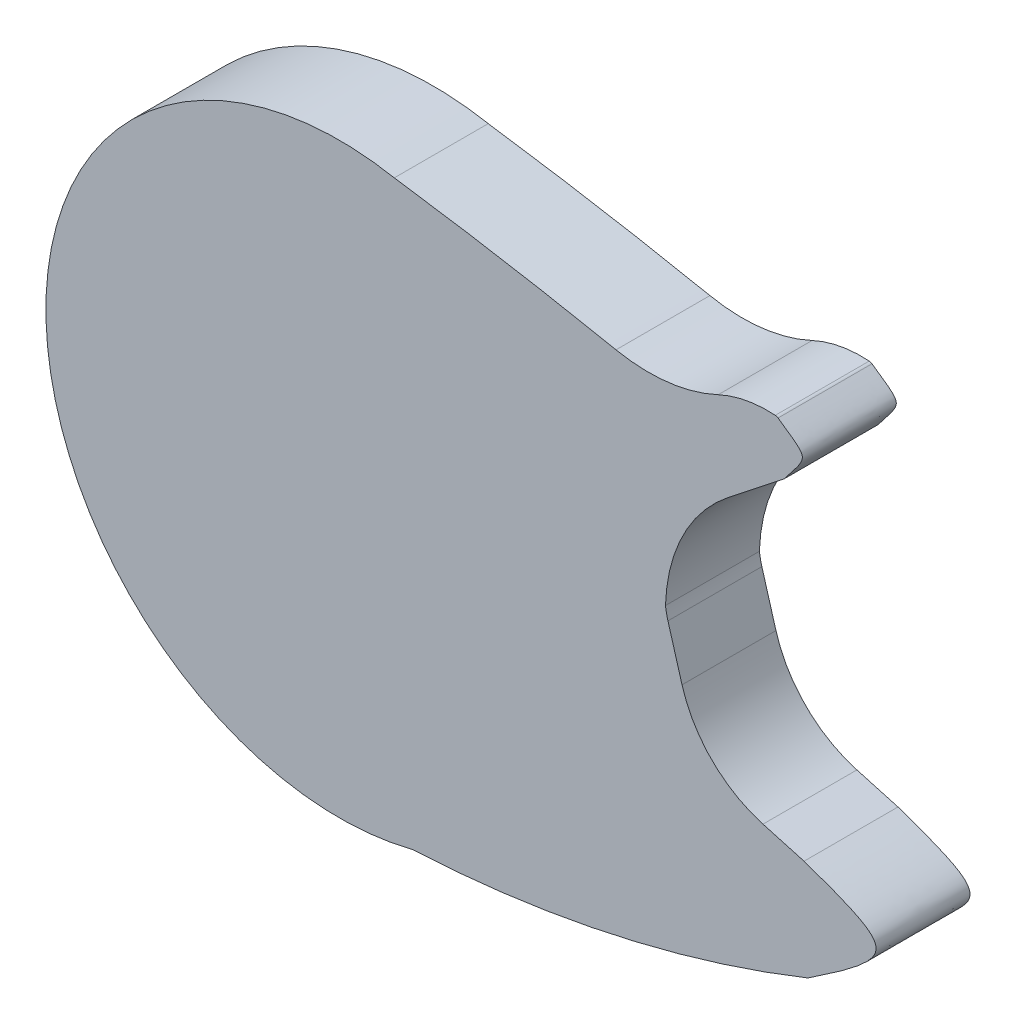
ISO-10303-21;
HEADER;
FILE_DESCRIPTION(('STEP AP214'),'2;1');
FILE_NAME('part.step','',(''),(''),'','','');
FILE_SCHEMA(('AUTOMOTIVE_DESIGN { 1 0 10303 214 1 1 1 1 }'));
ENDSEC;
DATA;
#1=APPLICATION_CONTEXT('core data for automotive mechanical design processes');
#2=APPLICATION_PROTOCOL_DEFINITION('international standard','automotive_design',2000,#1);
#3=PRODUCT_CONTEXT('',#1,'mechanical');
#4=PRODUCT('Part','Part','',(#3));
#5=PRODUCT_RELATED_PRODUCT_CATEGORY('part','',(#4));
#6=PRODUCT_DEFINITION_FORMATION('','',#4);
#7=PRODUCT_DEFINITION_CONTEXT('part definition',#1,'design');
#8=PRODUCT_DEFINITION('design','',#6,#7);
#9=PRODUCT_DEFINITION_SHAPE('','',#8);
#10=(LENGTH_UNIT() NAMED_UNIT(*) SI_UNIT(.MILLI.,.METRE.));
#11=(NAMED_UNIT(*) PLANE_ANGLE_UNIT() SI_UNIT($,.RADIAN.));
#12=(NAMED_UNIT(*) SI_UNIT($,.STERADIAN.) SOLID_ANGLE_UNIT());
#13=UNCERTAINTY_MEASURE_WITH_UNIT(LENGTH_MEASURE(1.E-05),#10,'distance_accuracy_value','');
#14=(GEOMETRIC_REPRESENTATION_CONTEXT(3) GLOBAL_UNCERTAINTY_ASSIGNED_CONTEXT((#13)) GLOBAL_UNIT_ASSIGNED_CONTEXT((#10,
#11,#12)) REPRESENTATION_CONTEXT('',''));
#15=CARTESIAN_POINT('',(0.,0.,0.));
#16=DIRECTION('',(0.,0.,1.));
#17=DIRECTION('',(1.,0.,0.));
#18=AXIS2_PLACEMENT_3D('',#15,#16,#17);
#19=CARTESIAN_POINT('',(0.,0.,0.));
#20=DIRECTION('',(0.,0.,1.));
#21=DIRECTION('',(1.,0.,0.));
#22=AXIS2_PLACEMENT_3D('',#19,#20,#21);
#23=PLANE('',#22);
#24=CARTESIAN_POINT('',(1.68720769985722,0.260608310681954,0.));
#25=DIRECTION('',(0.,0.,1.));
#26=DIRECTION('',(1.,0.,0.));
#27=AXIS2_PLACEMENT_3D('',#24,#25,#26);
#28=CIRCLE('',#27,0.3);
#29=CARTESIAN_POINT('',(1.38851734794613,0.227690829124057,0.));
#30=VERTEX_POINT('',#29);
#31=CARTESIAN_POINT('',(1.3991706844946,0.176735324679344,0.));
#32=VERTEX_POINT('',#31);
#33=EDGE_CURVE('E182',#30,#32,#28,.T.);
#34=ORIENTED_EDGE('',*,*,#33,.T.);
#35=DIRECTION('',(0.279576620008697,-0.960123384542066,0.));
#36=VECTOR('',#35,1.);
#37=CARTESIAN_POINT('',(1.33724790399965,0.389390837816383,0.));
#38=LINE('',#37,#36);
#39=CARTESIAN_POINT('',(1.45912919072284,-0.0291744682431,0.));
#40=VERTEX_POINT('',#39);
#41=EDGE_CURVE('E227',#32,#40,#38,.T.);
#42=ORIENTED_EDGE('',*,*,#41,.T.);
#43=CARTESIAN_POINT('',(1.93919088299388,0.110613841761249,0.));
#44=DIRECTION('',(0.,0.,1.));
#45=DIRECTION('',(1.,0.,0.));
#46=AXIS2_PLACEMENT_3D('',#43,#44,#45);
#47=CIRCLE('',#46,0.499999999999998);
#48=CARTESIAN_POINT('',(1.80392969712394,-0.370743002583002,0.));
#49=VERTEX_POINT('',#48);
#50=EDGE_CURVE('E225',#40,#49,#47,.T.);
#51=ORIENTED_EDGE('',*,*,#50,.T.);
#52=DIRECTION('',(0.962713688688509,-0.27052237173987,0.));
#53=VECTOR('',#52,1.);
#54=CARTESIAN_POINT('',(0.0354611482322684,0.126196338588383,0.));
#55=LINE('',#54,#53);
#56=CARTESIAN_POINT('',(1.97884477834677,-0.419894108650615,0.));
#57=VERTEX_POINT('',#56);
#58=EDGE_CURVE('E160',#49,#57,#55,.T.);
#59=ORIENTED_EDGE('',*,*,#58,.T.);
#60=CARTESIAN_POINT('',(1.99572109811097,-0.842296250533892,0.));
#61=CARTESIAN_POINT('',(2.41082933169147,-0.567859808421167,0.));
#62=CARTESIAN_POINT('',(1.97884477834677,-0.419894108650615,0.));
#63=(BOUNDED_CURVE() B_SPLINE_CURVE(2,(#60,#61,#62),.UNSPECIFIED.,.F.,
.F.) B_SPLINE_CURVE_WITH_KNOTS((3,3),(0.,1.),
.UNSPECIFIED.) CURVE() GEOMETRIC_REPRESENTATION_ITEM() RATIONAL_B_SPLINE_CURVE((1.,
2.37796476795875,1.)) REPRESENTATION_ITEM(''));
#64=CARTESIAN_POINT('',(1.99572109811097,-0.842296250533891,0.));
#65=VERTEX_POINT('',#64);
#66=EDGE_CURVE('E216',#65,#57,#63,.T.);
#67=ORIENTED_EDGE('',*,*,#66,.F.);
#68=CARTESIAN_POINT('',(0.0516204911302641,4.00637457906284,0.));
#69=DIRECTION('',(0.,0.,1.));
#70=DIRECTION('',(1.,0.,0.));
#71=AXIS2_PLACEMENT_3D('',#68,#69,#70);
#72=CIRCLE('',#71,5.22390045692345);
#73=CARTESIAN_POINT('',(0.309116921319376,-1.21117576303113,0.));
#74=VERTEX_POINT('',#73);
#75=EDGE_CURVE('E213',#65,#74,#72,.F.);
#76=ORIENTED_EDGE('',*,*,#75,.T.);
#77=CARTESIAN_POINT('',(0.,0.,0.));
#78=DIRECTION('',(0.,0.,1.));
#79=DIRECTION('',(1.,0.,0.));
#80=AXIS2_PLACEMENT_3D('',#77,#78,#79);
#81=CIRCLE('',#80,1.25);
#82=CARTESIAN_POINT('',(0.233831734369341,1.2279343304924,0.));
#83=VERTEX_POINT('',#82);
#84=EDGE_CURVE('E210',#83,#74,#81,.T.);
#85=ORIENTED_EDGE('',*,*,#84,.F.);
#86=CARTESIAN_POINT('',(-2.04961009553152,-14.8939138780352,0.));
#87=DIRECTION('',(0.,0.,1.));
#88=DIRECTION('',(1.,0.,0.));
#89=AXIS2_PLACEMENT_3D('',#86,#87,#88);
#90=CIRCLE('',#89,16.2827545657775);
#91=CARTESIAN_POINT('',(1.17795402322161,1.06575172337021,0.));
#92=VERTEX_POINT('',#91);
#93=EDGE_CURVE('E208',#92,#83,#90,.T.);
#94=ORIENTED_EDGE('',*,*,#93,.F.);
#95=CARTESIAN_POINT('',(1.31670787313074,1.75186204185798,0.));
#96=DIRECTION('',(0.,0.,1.));
#97=DIRECTION('',(1.,0.,0.));
#98=AXIS2_PLACEMENT_3D('',#95,#96,#97);
#99=CIRCLE('',#98,0.700000000000001);
#100=CARTESIAN_POINT('',(1.613052317064,1.11768543353039,0.));
#101=VERTEX_POINT('',#100);
#102=EDGE_CURVE('E206',#101,#92,#99,.F.);
#103=ORIENTED_EDGE('',*,*,#102,.F.);
#104=CARTESIAN_POINT('',(1.82398751273677,0.666284471888547,0.));
#105=DIRECTION('',(0.,0.,1.));
#106=DIRECTION('',(1.,0.,0.));
#107=AXIS2_PLACEMENT_3D('',#104,#105,#106);
#108=CIRCLE('',#107,0.498253434453484);
#109=CARTESIAN_POINT('',(1.85648734935261,1.16347683462619,0.));
#110=VERTEX_POINT('',#109);
#111=EDGE_CURVE('E204',#110,#101,#108,.T.);
#112=ORIENTED_EDGE('',*,*,#111,.F.);
#113=CARTESIAN_POINT('',(1.85494442950019,1.13987277851956,0.));
#114=DIRECTION('',(0.,0.,1.));
#115=DIRECTION('',(1.,0.,0.));
#116=AXIS2_PLACEMENT_3D('',#113,#114,#115);
#117=CIRCLE('',#116,0.023654430163407);
#118=CARTESIAN_POINT('',(1.86820923768672,1.15945789863996,0.));
#119=VERTEX_POINT('',#118);
#120=EDGE_CURVE('E199',#119,#110,#117,.T.);
#121=ORIENTED_EDGE('',*,*,#120,.F.);
#122=CARTESIAN_POINT('',(1.89441183631001,0.94809673782148,0.));
#123=CARTESIAN_POINT('',(1.99572109811097,1.07309537649882,0.));
#124=CARTESIAN_POINT('',(1.86820923768672,1.15945789863996,0.));
#125=(BOUNDED_CURVE() B_SPLINE_CURVE(2,(#122,#123,#124),.UNSPECIFIED.,.F.,
.F.) B_SPLINE_CURVE_WITH_KNOTS((3,3),(0.,1.),
.UNSPECIFIED.) CURVE() GEOMETRIC_REPRESENTATION_ITEM() RATIONAL_B_SPLINE_CURVE((1.,
3.70941285067081,1.)) REPRESENTATION_ITEM(''));
#126=CARTESIAN_POINT('',(1.89441183631001,0.94809673782148,0.));
#127=VERTEX_POINT('',#126);
#128=EDGE_CURVE('E195',#127,#119,#125,.T.);
#129=ORIENTED_EDGE('',*,*,#128,.F.);
#130=DIRECTION('',(-0.785367527781347,-0.61902976205237,0.));
#131=VECTOR('',#130,1.);
#132=CARTESIAN_POINT('',(0.265002256658093,-0.336210276026174,0.));
#133=LINE('',#132,#131);
#134=CARTESIAN_POINT('',(1.65547294782722,0.759764169883003,0.));
#135=VERTEX_POINT('',#134);
#136=EDGE_CURVE('E190',#127,#135,#133,.T.);
#137=ORIENTED_EDGE('',*,*,#136,.T.);
#138=CARTESIAN_POINT('',(2.08879378126389,0.21000690043606,0.));
#139=DIRECTION('',(0.,0.,1.));
#140=DIRECTION('',(1.,0.,0.));
#141=AXIS2_PLACEMENT_3D('',#138,#139,#140);
#142=CIRCLE('',#141,0.700000000000001);
#143=EDGE_CURVE('E184',#135,#30,#142,.T.);
#144=ORIENTED_EDGE('',*,*,#143,.T.);
#145=EDGE_LOOP('',(#34,#42,#51,#59,#67,#76,#85,#94,#103,#112,#121,#129,#137,#144));
#146=FACE_BOUND('',#145,.T.);
#147=CARTESIAN_POINT('',(0.,0.,0.));
#148=DIRECTION('',(0.,0.,-1.));
#149=DIRECTION('',(-1.,0.,0.));
#150=AXIS2_PLACEMENT_3D('',#147,#148,#149);
#151=CIRCLE('',#150,0.75);
#152=CARTESIAN_POINT('',(-0.75,0.,0.));
#153=VERTEX_POINT('',#152);
#154=EDGE_CURVE('E565',#153,#153,#151,.T.);
#155=ORIENTED_EDGE('',*,*,#154,.F.);
#156=EDGE_LOOP('',(#155));
#157=FACE_BOUND('',#156,.T.);
#158=ADVANCED_FACE('F46',(#146,#157),#23,.F.);
#159=CARTESIAN_POINT('',(1.68720769985722,0.260608310681954,0.4));
#160=DIRECTION('',(0.,0.,-1.));
#161=DIRECTION('',(-1.,0.,0.));
#162=AXIS2_PLACEMENT_3D('',#159,#160,#161);
#163=CYLINDRICAL_SURFACE('',#162,0.3);
#164=ORIENTED_EDGE('',*,*,#33,.F.);
#165=CARTESIAN_POINT('',(1.38901687063512,0.227678214786076,0.4));
#166=DIRECTION('',(0.,0.,-1.));
#167=VECTOR('',#166,1.);
#168=LINE('',#165,#167);
#169=CARTESIAN_POINT('',(1.38851734794613,0.227690829124057,0.4));
#170=VERTEX_POINT('',#169);
#171=EDGE_CURVE('E12',#170,#30,#168,.T.);
#172=ORIENTED_EDGE('',*,*,#171,.F.);
#173=CARTESIAN_POINT('',(1.68720769985722,0.260608310681954,0.4));
#174=DIRECTION('',(0.,0.,1.));
#175=DIRECTION('',(1.,0.,0.));
#176=AXIS2_PLACEMENT_3D('',#173,#174,#175);
#177=CIRCLE('',#176,0.3);
#178=CARTESIAN_POINT('',(1.3991706844946,0.176735324679344,0.4));
#179=VERTEX_POINT('',#178);
#180=EDGE_CURVE('E230',#170,#179,#177,.T.);
#181=ORIENTED_EDGE('',*,*,#180,.T.);
#182=DIRECTION('',(0.,0.,-1.));
#183=VECTOR('',#182,1.);
#184=CARTESIAN_POINT('',(1.3991706844946,0.176735324679344,0.4));
#185=LINE('',#184,#183);
#186=EDGE_CURVE('E66',#179,#32,#185,.T.);
#187=ORIENTED_EDGE('',*,*,#186,.T.);
#188=EDGE_LOOP('',(#164,#172,#181,#187));
#189=FACE_BOUND('',#188,.T.);
#190=ADVANCED_FACE('F48',(#189),#163,.F.);
#191=CARTESIAN_POINT('',(2.08879378126389,0.21000690043606,0.4));
#192=DIRECTION('',(0.,0.,-1.));
#193=DIRECTION('',(-1.,0.,0.));
#194=AXIS2_PLACEMENT_3D('',#191,#192,#193);
#195=CYLINDRICAL_SURFACE('',#194,0.700000000000001);
#196=ORIENTED_EDGE('',*,*,#143,.F.);
#197=DIRECTION('',(0.,0.,-1.));
#198=VECTOR('',#197,1.);
#199=CARTESIAN_POINT('',(1.65547294782722,0.759764169883003,0.4));
#200=LINE('',#199,#198);
#201=CARTESIAN_POINT('',(1.65547294782722,0.759764169883003,0.4));
#202=VERTEX_POINT('',#201);
#203=EDGE_CURVE('E58',#202,#135,#200,.T.);
#204=ORIENTED_EDGE('',*,*,#203,.F.);
#205=CARTESIAN_POINT('',(2.08879378126389,0.21000690043606,0.4));
#206=DIRECTION('',(0.,0.,1.));
#207=DIRECTION('',(1.,0.,0.));
#208=AXIS2_PLACEMENT_3D('',#205,#206,#207);
#209=CIRCLE('',#208,0.700000000000001);
#210=EDGE_CURVE('E574',#202,#170,#209,.T.);
#211=ORIENTED_EDGE('',*,*,#210,.T.);
#212=ORIENTED_EDGE('',*,*,#171,.T.);
#213=EDGE_LOOP('',(#196,#204,#211,#212));
#214=FACE_BOUND('',#213,.T.);
#215=ADVANCED_FACE('F262',(#214),#195,.F.);
#216=CARTESIAN_POINT('',(0.265002256658093,-0.336210276026174,0.4));
#217=DIRECTION('',(0.61902976205237,-0.785367527781347,0.));
#218=DIRECTION('',(0.785367527781347,0.61902976205237,0.));
#219=AXIS2_PLACEMENT_3D('',#216,#217,#218);
#220=PLANE('',#219);
#221=ORIENTED_EDGE('',*,*,#136,.F.);
#222=DIRECTION('',(0.,0.,-1.));
#223=VECTOR('',#222,1.);
#224=CARTESIAN_POINT('',(1.89441183631001,0.94809673782148,0.4));
#225=LINE('',#224,#223);
#226=CARTESIAN_POINT('',(1.89441183631001,0.94809673782148,0.4));
#227=VERTEX_POINT('',#226);
#228=EDGE_CURVE('E253',#227,#127,#225,.T.);
#229=ORIENTED_EDGE('',*,*,#228,.F.);
#230=DIRECTION('',(-0.785367527781347,-0.61902976205237,0.));
#231=VECTOR('',#230,1.);
#232=CARTESIAN_POINT('',(0.265002256658093,-0.336210276026174,0.4));
#233=LINE('',#232,#231);
#234=EDGE_CURVE('E289',#227,#202,#233,.T.);
#235=ORIENTED_EDGE('',*,*,#234,.T.);
#236=ORIENTED_EDGE('',*,*,#203,.T.);
#237=EDGE_LOOP('',(#221,#229,#235,#236));
#238=FACE_BOUND('',#237,.T.);
#239=ADVANCED_FACE('F271',(#238),#220,.T.);
#240=CARTESIAN_POINT('',(1.89441183631001,0.94809673782148,0.4));
#241=CARTESIAN_POINT('',(1.99572109811097,1.07309537649882,0.4));
#242=CARTESIAN_POINT('',(1.86820923768672,1.15945789863996,0.4));
#243=(BOUNDED_CURVE() B_SPLINE_CURVE(2,(#240,#241,#242),.UNSPECIFIED.,.F.,
.F.) B_SPLINE_CURVE_WITH_KNOTS((3,3),(0.,1.),
.UNSPECIFIED.) CURVE() GEOMETRIC_REPRESENTATION_ITEM() RATIONAL_B_SPLINE_CURVE((1.,
3.70941285067081,1.)) REPRESENTATION_ITEM(''));
#244=DIRECTION('',(0.,0.,-1.));
#245=VECTOR('',#244,1.);
#246=SURFACE_OF_LINEAR_EXTRUSION('',#243,#245);
#247=ORIENTED_EDGE('',*,*,#128,.T.);
#248=DIRECTION('',(0.,0.,-1.));
#249=VECTOR('',#248,1.);
#250=CARTESIAN_POINT('',(1.86820923768672,1.15945789863996,0.4));
#251=LINE('',#250,#249);
#252=CARTESIAN_POINT('',(1.86820923768672,1.15945789863996,0.4));
#253=VERTEX_POINT('',#252);
#254=EDGE_CURVE('E250',#253,#119,#251,.T.);
#255=ORIENTED_EDGE('',*,*,#254,.F.);
#256=EDGE_CURVE('E282',#227,#253,#243,.T.);
#257=ORIENTED_EDGE('',*,*,#256,.F.);
#258=ORIENTED_EDGE('',*,*,#228,.T.);
#259=EDGE_LOOP('',(#247,#255,#257,#258));
#260=FACE_BOUND('',#259,.T.);
#261=ADVANCED_FACE('F274',(#260),#246,.F.);
#262=CARTESIAN_POINT('',(1.85494442950019,1.13987277851956,0.4));
#263=DIRECTION('',(0.,0.,-1.));
#264=DIRECTION('',(-1.,0.,0.));
#265=AXIS2_PLACEMENT_3D('',#262,#263,#264);
#266=CYLINDRICAL_SURFACE('',#265,0.023654430163407);
#267=ORIENTED_EDGE('',*,*,#120,.T.);
#268=DIRECTION('',(0.,0.,-1.));
#269=VECTOR('',#268,1.);
#270=CARTESIAN_POINT('',(1.85648734935261,1.16347683462619,0.4));
#271=LINE('',#270,#269);
#272=CARTESIAN_POINT('',(1.85648734935261,1.16347683462619,0.4));
#273=VERTEX_POINT('',#272);
#274=EDGE_CURVE('E247',#273,#110,#271,.T.);
#275=ORIENTED_EDGE('',*,*,#274,.F.);
#276=CARTESIAN_POINT('',(1.85494442950019,1.13987277851956,0.4));
#277=DIRECTION('',(0.,0.,1.));
#278=DIRECTION('',(1.,0.,0.));
#279=AXIS2_PLACEMENT_3D('',#276,#277,#278);
#280=CIRCLE('',#279,0.023654430163407);
#281=EDGE_CURVE('E288',#253,#273,#280,.T.);
#282=ORIENTED_EDGE('',*,*,#281,.F.);
#283=ORIENTED_EDGE('',*,*,#254,.T.);
#284=EDGE_LOOP('',(#267,#275,#282,#283));
#285=FACE_BOUND('',#284,.T.);
#286=ADVANCED_FACE('F279',(#285),#266,.T.);
#287=CARTESIAN_POINT('',(1.82398751273677,0.666284471888547,0.4));
#288=DIRECTION('',(0.,0.,-1.));
#289=DIRECTION('',(-1.,0.,0.));
#290=AXIS2_PLACEMENT_3D('',#287,#288,#289);
#291=CYLINDRICAL_SURFACE('',#290,0.498253434453484);
#292=ORIENTED_EDGE('',*,*,#111,.T.);
#293=DIRECTION('',(0.,0.,-1.));
#294=VECTOR('',#293,1.);
#295=CARTESIAN_POINT('',(1.613052317064,1.11768543353039,0.4));
#296=LINE('',#295,#294);
#297=CARTESIAN_POINT('',(1.613052317064,1.11768543353039,0.4));
#298=VERTEX_POINT('',#297);
#299=EDGE_CURVE('E244',#298,#101,#296,.T.);
#300=ORIENTED_EDGE('',*,*,#299,.F.);
#301=CARTESIAN_POINT('',(1.82398751273677,0.666284471888547,0.4));
#302=DIRECTION('',(0.,0.,1.));
#303=DIRECTION('',(1.,0.,0.));
#304=AXIS2_PLACEMENT_3D('',#301,#302,#303);
#305=CIRCLE('',#304,0.498253434453484);
#306=EDGE_CURVE('E295',#273,#298,#305,.T.);
#307=ORIENTED_EDGE('',*,*,#306,.F.);
#308=ORIENTED_EDGE('',*,*,#274,.T.);
#309=EDGE_LOOP('',(#292,#300,#307,#308));
#310=FACE_BOUND('',#309,.T.);
#311=ADVANCED_FACE('F332',(#310),#291,.T.);
#312=CARTESIAN_POINT('',(1.31670787313074,1.75186204185798,0.4));
#313=DIRECTION('',(0.,0.,-1.));
#314=DIRECTION('',(-1.,0.,0.));
#315=AXIS2_PLACEMENT_3D('',#312,#313,#314);
#316=CYLINDRICAL_SURFACE('',#315,0.700000000000001);
#317=ORIENTED_EDGE('',*,*,#102,.T.);
#318=DIRECTION('',(0.,0.,-1.));
#319=VECTOR('',#318,1.);
#320=CARTESIAN_POINT('',(1.17795402322161,1.06575172337021,0.4));
#321=LINE('',#320,#319);
#322=CARTESIAN_POINT('',(1.17795402322161,1.06575172337021,0.4));
#323=VERTEX_POINT('',#322);
#324=EDGE_CURVE('E241',#323,#92,#321,.T.);
#325=ORIENTED_EDGE('',*,*,#324,.F.);
#326=CARTESIAN_POINT('',(1.31670787313074,1.75186204185798,0.4));
#327=DIRECTION('',(0.,0.,1.));
#328=DIRECTION('',(1.,0.,0.));
#329=AXIS2_PLACEMENT_3D('',#326,#327,#328);
#330=CIRCLE('',#329,0.700000000000001);
#331=EDGE_CURVE('E297',#298,#323,#330,.F.);
#332=ORIENTED_EDGE('',*,*,#331,.F.);
#333=ORIENTED_EDGE('',*,*,#299,.T.);
#334=EDGE_LOOP('',(#317,#325,#332,#333));
#335=FACE_BOUND('',#334,.T.);
#336=ADVANCED_FACE('F329',(#335),#316,.F.);
#337=CARTESIAN_POINT('',(-2.04961009553152,-14.8939138780352,0.4));
#338=DIRECTION('',(0.,0.,-1.));
#339=DIRECTION('',(-1.,0.,0.));
#340=AXIS2_PLACEMENT_3D('',#337,#338,#339);
#341=CYLINDRICAL_SURFACE('',#340,16.2827545657775);
#342=ORIENTED_EDGE('',*,*,#93,.T.);
#343=DIRECTION('',(0.,0.,-1.));
#344=VECTOR('',#343,1.);
#345=CARTESIAN_POINT('',(0.233831734369341,1.2279343304924,0.4));
#346=LINE('',#345,#344);
#347=CARTESIAN_POINT('',(0.233831734369341,1.2279343304924,0.4));
#348=VERTEX_POINT('',#347);
#349=EDGE_CURVE('E238',#348,#83,#346,.T.);
#350=ORIENTED_EDGE('',*,*,#349,.F.);
#351=CARTESIAN_POINT('',(-2.04961009553152,-14.8939138780352,0.4));
#352=DIRECTION('',(0.,0.,1.));
#353=DIRECTION('',(1.,0.,0.));
#354=AXIS2_PLACEMENT_3D('',#351,#352,#353);
#355=CIRCLE('',#354,16.2827545657775);
#356=EDGE_CURVE('E299',#323,#348,#355,.T.);
#357=ORIENTED_EDGE('',*,*,#356,.F.);
#358=ORIENTED_EDGE('',*,*,#324,.T.);
#359=EDGE_LOOP('',(#342,#350,#357,#358));
#360=FACE_BOUND('',#359,.T.);
#361=ADVANCED_FACE('F325',(#360),#341,.T.);
#362=CARTESIAN_POINT('',(0.,0.,0.4));
#363=DIRECTION('',(0.,0.,-1.));
#364=DIRECTION('',(-1.,0.,0.));
#365=AXIS2_PLACEMENT_3D('',#362,#363,#364);
#366=CYLINDRICAL_SURFACE('',#365,1.25);
#367=ORIENTED_EDGE('',*,*,#84,.T.);
#368=DIRECTION('',(0.,0.,-1.));
#369=VECTOR('',#368,1.);
#370=CARTESIAN_POINT('',(0.309116921319376,-1.21117576303113,0.4));
#371=LINE('',#370,#369);
#372=CARTESIAN_POINT('',(0.309116921319376,-1.21117576303113,0.4));
#373=VERTEX_POINT('',#372);
#374=EDGE_CURVE('E236',#373,#74,#371,.T.);
#375=ORIENTED_EDGE('',*,*,#374,.F.);
#376=CARTESIAN_POINT('',(0.,0.,0.4));
#377=DIRECTION('',(0.,0.,1.));
#378=DIRECTION('',(1.,0.,0.));
#379=AXIS2_PLACEMENT_3D('',#376,#377,#378);
#380=CIRCLE('',#379,1.25);
#381=EDGE_CURVE('E301',#348,#373,#380,.T.);
#382=ORIENTED_EDGE('',*,*,#381,.F.);
#383=ORIENTED_EDGE('',*,*,#349,.T.);
#384=EDGE_LOOP('',(#367,#375,#382,#383));
#385=FACE_BOUND('',#384,.T.);
#386=ADVANCED_FACE('F321',(#385),#366,.T.);
#387=CARTESIAN_POINT('',(0.0516204911302641,4.00637457906284,0.4));
#388=DIRECTION('',(0.,0.,-1.));
#389=DIRECTION('',(-1.,0.,0.));
#390=AXIS2_PLACEMENT_3D('',#387,#388,#389);
#391=CYLINDRICAL_SURFACE('',#390,5.22390045692345);
#392=ORIENTED_EDGE('',*,*,#75,.F.);
#393=DIRECTION('',(0.,0.,-1.));
#394=VECTOR('',#393,1.);
#395=CARTESIAN_POINT('',(1.99572109811097,-0.842296250533891,0.4));
#396=LINE('',#395,#394);
#397=CARTESIAN_POINT('',(1.99572109811097,-0.842296250533891,0.4));
#398=VERTEX_POINT('',#397);
#399=EDGE_CURVE('E234',#398,#65,#396,.T.);
#400=ORIENTED_EDGE('',*,*,#399,.F.);
#401=CARTESIAN_POINT('',(0.0516204911302641,4.00637457906284,0.4));
#402=DIRECTION('',(0.,0.,1.));
#403=DIRECTION('',(1.,0.,0.));
#404=AXIS2_PLACEMENT_3D('',#401,#402,#403);
#405=CIRCLE('',#404,5.22390045692345);
#406=EDGE_CURVE('E303',#398,#373,#405,.F.);
#407=ORIENTED_EDGE('',*,*,#406,.T.);
#408=ORIENTED_EDGE('',*,*,#374,.T.);
#409=EDGE_LOOP('',(#392,#400,#407,#408));
#410=FACE_BOUND('',#409,.T.);
#411=ADVANCED_FACE('F316',(#410),#391,.T.);
#412=CARTESIAN_POINT('',(1.99572109811097,-0.842296250533892,0.4));
#413=CARTESIAN_POINT('',(2.41082933169147,-0.567859808421167,0.4));
#414=CARTESIAN_POINT('',(1.97884477834677,-0.419894108650615,0.4));
#415=(BOUNDED_CURVE() B_SPLINE_CURVE(2,(#412,#413,#414),.UNSPECIFIED.,.F.,
.F.) B_SPLINE_CURVE_WITH_KNOTS((3,3),(0.,1.),
.UNSPECIFIED.) CURVE() GEOMETRIC_REPRESENTATION_ITEM() RATIONAL_B_SPLINE_CURVE((1.,
2.37796476795875,1.)) REPRESENTATION_ITEM(''));
#416=DIRECTION('',(0.,0.,-1.));
#417=VECTOR('',#416,1.);
#418=SURFACE_OF_LINEAR_EXTRUSION('',#415,#417);
#419=ORIENTED_EDGE('',*,*,#66,.T.);
#420=DIRECTION('',(0.,0.,-1.));
#421=VECTOR('',#420,1.);
#422=CARTESIAN_POINT('',(1.97884477834677,-0.419894108650615,0.4));
#423=LINE('',#422,#421);
#424=CARTESIAN_POINT('',(1.97884477834677,-0.419894108650615,0.4));
#425=VERTEX_POINT('',#424);
#426=EDGE_CURVE('E164',#425,#57,#423,.T.);
#427=ORIENTED_EDGE('',*,*,#426,.F.);
#428=EDGE_CURVE('E173',#398,#425,#415,.T.);
#429=ORIENTED_EDGE('',*,*,#428,.F.);
#430=ORIENTED_EDGE('',*,*,#399,.T.);
#431=EDGE_LOOP('',(#419,#427,#429,#430));
#432=FACE_BOUND('',#431,.T.);
#433=ADVANCED_FACE('F312',(#432),#418,.F.);
#434=CARTESIAN_POINT('',(0.0354611482322684,0.126196338588383,0.4));
#435=DIRECTION('',(0.27052237173987,0.962713688688509,0.));
#436=DIRECTION('',(-0.962713688688509,0.27052237173987,0.));
#437=AXIS2_PLACEMENT_3D('',#434,#435,#436);
#438=PLANE('',#437);
#439=ORIENTED_EDGE('',*,*,#58,.F.);
#440=DIRECTION('',(0.,0.,-1.));
#441=VECTOR('',#440,1.);
#442=CARTESIAN_POINT('',(1.80392969712394,-0.370743002583002,0.4));
#443=LINE('',#442,#441);
#444=CARTESIAN_POINT('',(1.80392969712394,-0.370743002583002,0.4));
#445=VERTEX_POINT('',#444);
#446=EDGE_CURVE('E155',#445,#49,#443,.T.);
#447=ORIENTED_EDGE('',*,*,#446,.F.);
#448=DIRECTION('',(0.962713688688509,-0.27052237173987,0.));
#449=VECTOR('',#448,1.);
#450=CARTESIAN_POINT('',(0.0354611482322684,0.126196338588383,0.4));
#451=LINE('',#450,#449);
#452=EDGE_CURVE('E158',#445,#425,#451,.T.);
#453=ORIENTED_EDGE('',*,*,#452,.T.);
#454=ORIENTED_EDGE('',*,*,#426,.T.);
#455=EDGE_LOOP('',(#439,#447,#453,#454));
#456=FACE_BOUND('',#455,.T.);
#457=ADVANCED_FACE('F157',(#456),#438,.T.);
#458=CARTESIAN_POINT('',(1.93919088299388,0.110613841761249,0.4));
#459=DIRECTION('',(0.,0.,-1.));
#460=DIRECTION('',(-1.,0.,0.));
#461=AXIS2_PLACEMENT_3D('',#458,#459,#460);
#462=CYLINDRICAL_SURFACE('',#461,0.499999999999998);
#463=ORIENTED_EDGE('',*,*,#50,.F.);
#464=DIRECTION('',(0.,0.,-1.));
#465=VECTOR('',#464,1.);
#466=CARTESIAN_POINT('',(1.45912919072284,-0.0291744682431,0.4));
#467=LINE('',#466,#465);
#468=CARTESIAN_POINT('',(1.45912919072284,-0.0291744682431,0.4));
#469=VERTEX_POINT('',#468);
#470=EDGE_CURVE('E110',#469,#40,#467,.T.);
#471=ORIENTED_EDGE('',*,*,#470,.F.);
#472=CARTESIAN_POINT('',(1.93919088299388,0.110613841761249,0.4));
#473=DIRECTION('',(0.,0.,1.));
#474=DIRECTION('',(1.,0.,0.));
#475=AXIS2_PLACEMENT_3D('',#472,#473,#474);
#476=CIRCLE('',#475,0.499999999999998);
#477=EDGE_CURVE('E170',#469,#445,#476,.T.);
#478=ORIENTED_EDGE('',*,*,#477,.T.);
#479=ORIENTED_EDGE('',*,*,#446,.T.);
#480=EDGE_LOOP('',(#463,#471,#478,#479));
#481=FACE_BOUND('',#480,.T.);
#482=ADVANCED_FACE('F176',(#481),#462,.F.);
#483=CARTESIAN_POINT('',(1.33724790399965,0.389390837816383,0.4));
#484=DIRECTION('',(0.960123384542066,0.279576620008697,0.));
#485=DIRECTION('',(-0.279576620008697,0.960123384542066,0.));
#486=AXIS2_PLACEMENT_3D('',#483,#484,#485);
#487=PLANE('',#486);
#488=ORIENTED_EDGE('',*,*,#41,.F.);
#489=ORIENTED_EDGE('',*,*,#186,.F.);
#490=DIRECTION('',(0.279576620008697,-0.960123384542066,0.));
#491=VECTOR('',#490,1.);
#492=CARTESIAN_POINT('',(1.33724790399965,0.389390837816383,0.4));
#493=LINE('',#492,#491);
#494=EDGE_CURVE('E177',#179,#469,#493,.T.);
#495=ORIENTED_EDGE('',*,*,#494,.T.);
#496=ORIENTED_EDGE('',*,*,#470,.T.);
#497=EDGE_LOOP('',(#488,#489,#495,#496));
#498=FACE_BOUND('',#497,.T.);
#499=ADVANCED_FACE('F350',(#498),#487,.T.);
#500=CARTESIAN_POINT('',(0.,0.,0.4));
#501=DIRECTION('',(0.,0.,1.));
#502=DIRECTION('',(1.,0.,0.));
#503=AXIS2_PLACEMENT_3D('',#500,#501,#502);
#504=PLANE('',#503);
#505=ORIENTED_EDGE('',*,*,#180,.F.);
#506=ORIENTED_EDGE('',*,*,#210,.F.);
#507=ORIENTED_EDGE('',*,*,#234,.F.);
#508=ORIENTED_EDGE('',*,*,#256,.T.);
#509=ORIENTED_EDGE('',*,*,#281,.T.);
#510=ORIENTED_EDGE('',*,*,#306,.T.);
#511=ORIENTED_EDGE('',*,*,#331,.T.);
#512=ORIENTED_EDGE('',*,*,#356,.T.);
#513=ORIENTED_EDGE('',*,*,#381,.T.);
#514=ORIENTED_EDGE('',*,*,#406,.F.);
#515=ORIENTED_EDGE('',*,*,#428,.T.);
#516=ORIENTED_EDGE('',*,*,#452,.F.);
#517=ORIENTED_EDGE('',*,*,#477,.F.);
#518=ORIENTED_EDGE('',*,*,#494,.F.);
#519=EDGE_LOOP('',(#505,#506,#507,#508,#509,#510,#511,#512,#513,#514,#515,#516,#517,#518));
#520=FACE_BOUND('',#519,.T.);
#521=ADVANCED_FACE('F168',(#520),#504,.T.);
#522=CARTESIAN_POINT('',(0.,0.,0.02));
#523=DIRECTION('',(0.,0.,-1.));
#524=DIRECTION('',(-1.,0.,0.));
#525=AXIS2_PLACEMENT_3D('',#522,#523,#524);
#526=CYLINDRICAL_SURFACE('',#525,0.75);
#527=ORIENTED_EDGE('',*,*,#154,.T.);
#528=EDGE_LOOP('',(#527));
#529=FACE_BOUND('',#528,.T.);
#530=DIRECTION('',(0.,0.,-1.));
#531=VECTOR('',#530,1.);
#532=CARTESIAN_POINT('',(-0.430503755118132,-0.614138841654872,0.05));
#533=LINE('',#532,#531);
#534=CARTESIAN_POINT('',(-0.430503755118132,-0.614138841654872,0.05));
#535=VERTEX_POINT('',#534);
#536=CARTESIAN_POINT('',(-0.430503755118132,-0.614138841654872,0.02));
#537=VERTEX_POINT('',#536);
#538=EDGE_CURVE('E555',#535,#537,#533,.T.);
#539=ORIENTED_EDGE('',*,*,#538,.T.);
#540=CARTESIAN_POINT('',(0.,0.,0.02));
#541=DIRECTION('',(0.,0.,-1.));
#542=DIRECTION('',(-1.,0.,0.));
#543=AXIS2_PLACEMENT_3D('',#540,#541,#542);
#544=CIRCLE('',#543,0.75);
#545=CARTESIAN_POINT('',(0.50838006425958,0.55140702776028,0.02));
#546=VERTEX_POINT('',#545);
#547=EDGE_CURVE('E185',#546,#537,#544,.T.);
#548=ORIENTED_EDGE('',*,*,#547,.F.);
#549=DIRECTION('',(0.,0.,-1.));
#550=VECTOR('',#549,1.);
#551=CARTESIAN_POINT('',(0.50838006425958,0.55140702776028,0.05));
#552=LINE('',#551,#550);
#553=CARTESIAN_POINT('',(0.50838006425958,0.55140702776028,0.05));
#554=VERTEX_POINT('',#553);
#555=EDGE_CURVE('E549',#554,#546,#552,.T.);
#556=ORIENTED_EDGE('',*,*,#555,.F.);
#557=CARTESIAN_POINT('',(0.,0.,0.05));
#558=DIRECTION('',(0.,0.,-1.));
#559=DIRECTION('',(-1.,0.,0.));
#560=AXIS2_PLACEMENT_3D('',#557,#558,#559);
#561=CIRCLE('',#560,0.75);
#562=CARTESIAN_POINT('',(0.430503755118132,0.614138841654872,0.05));
#563=VERTEX_POINT('',#562);
#564=EDGE_CURVE('E530',#563,#554,#561,.T.);
#565=ORIENTED_EDGE('',*,*,#564,.F.);
#566=DIRECTION('',(0.,0.,-1.));
#567=VECTOR('',#566,1.);
#568=CARTESIAN_POINT('',(0.430503755118132,0.614138841654872,0.05));
#569=LINE('',#568,#567);
#570=CARTESIAN_POINT('',(0.430503755118132,0.614138841654872,0.02));
#571=VERTEX_POINT('',#570);
#572=EDGE_CURVE('E545',#563,#571,#569,.T.);
#573=ORIENTED_EDGE('',*,*,#572,.T.);
#574=CARTESIAN_POINT('',(0.,0.,0.02));
#575=DIRECTION('',(0.,0.,-1.));
#576=DIRECTION('',(-1.,0.,0.));
#577=AXIS2_PLACEMENT_3D('',#574,#575,#576);
#578=CIRCLE('',#577,0.75);
#579=CARTESIAN_POINT('',(-0.50838006425958,-0.55140702776028,0.02));
#580=VERTEX_POINT('',#579);
#581=EDGE_CURVE('E562',#580,#571,#578,.T.);
#582=ORIENTED_EDGE('',*,*,#581,.F.);
#583=DIRECTION('',(0.,0.,-1.));
#584=VECTOR('',#583,1.);
#585=CARTESIAN_POINT('',(-0.50838006425958,-0.55140702776028,0.05));
#586=LINE('',#585,#584);
#587=CARTESIAN_POINT('',(-0.50838006425958,-0.55140702776028,0.05));
#588=VERTEX_POINT('',#587);
#589=EDGE_CURVE('E563',#588,#580,#586,.T.);
#590=ORIENTED_EDGE('',*,*,#589,.F.);
#591=EDGE_CURVE('E533',#535,#588,#561,.T.);
#592=ORIENTED_EDGE('',*,*,#591,.F.);
#593=EDGE_LOOP('',(#539,#548,#556,#565,#573,#582,#590,#592));
#594=FACE_BOUND('',#593,.T.);
#595=ADVANCED_FACE('F441',(#529,#594),#526,.F.);
#596=CARTESIAN_POINT('',(0.,0.,0.02));
#597=DIRECTION('',(0.,0.,-1.));
#598=DIRECTION('',(-1.,0.,0.));
#599=AXIS2_PLACEMENT_3D('',#596,#597,#598);
#600=PLANE('',#599);
#601=DIRECTION('',(-0.627318138945919,-0.778763091414474,0.));
#602=VECTOR('',#601,1.);
#603=CARTESIAN_POINT('',(0.0389381545707237,-0.031365906947296,0.02));
#604=LINE('',#603,#602);
#605=EDGE_CURVE('E566',#546,#537,#604,.T.);
#606=ORIENTED_EDGE('',*,*,#605,.F.);
#607=ORIENTED_EDGE('',*,*,#547,.T.);
#608=EDGE_LOOP('',(#606,#607));
#609=FACE_BOUND('',#608,.T.);
#610=ADVANCED_FACE('F465',(#609),#600,.T.);
#611=CARTESIAN_POINT('',(0.,0.,0.02));
#612=DIRECTION('',(0.,0.,-1.));
#613=DIRECTION('',(-1.,0.,0.));
#614=AXIS2_PLACEMENT_3D('',#611,#612,#613);
#615=PLANE('',#614);
#616=DIRECTION('',(-0.627318138945919,-0.778763091414474,0.));
#617=VECTOR('',#616,1.);
#618=CARTESIAN_POINT('',(-0.0389381545707236,0.0313659069472959,0.02));
#619=LINE('',#618,#617);
#620=EDGE_CURVE('E559',#571,#580,#619,.T.);
#621=ORIENTED_EDGE('',*,*,#620,.T.);
#622=ORIENTED_EDGE('',*,*,#581,.T.);
#623=EDGE_LOOP('',(#621,#622));
#624=FACE_BOUND('',#623,.T.);
#625=ADVANCED_FACE('F475',(#624),#615,.T.);
#626=CARTESIAN_POINT('',(-0.0389381545707236,0.0313659069472959,0.05));
#627=DIRECTION('',(0.778763091414474,-0.627318138945919,0.));
#628=DIRECTION('',(0.627318138945919,0.778763091414474,0.));
#629=AXIS2_PLACEMENT_3D('',#626,#627,#628);
#630=PLANE('',#629);
#631=ORIENTED_EDGE('',*,*,#572,.F.);
#632=DIRECTION('',(-0.627318138945919,-0.778763091414474,0.));
#633=VECTOR('',#632,1.);
#634=CARTESIAN_POINT('',(-0.0389381545707236,0.0313659069472959,0.05));
#635=LINE('',#634,#633);
#636=EDGE_CURVE('E526',#563,#588,#635,.T.);
#637=ORIENTED_EDGE('',*,*,#636,.T.);
#638=ORIENTED_EDGE('',*,*,#589,.T.);
#639=ORIENTED_EDGE('',*,*,#620,.F.);
#640=EDGE_LOOP('',(#631,#637,#638,#639));
#641=FACE_BOUND('',#640,.T.);
#642=ADVANCED_FACE('F483',(#641),#630,.T.);
#643=CARTESIAN_POINT('',(0.0389381545707237,-0.031365906947296,0.05));
#644=DIRECTION('',(0.778763091414474,-0.627318138945919,0.));
#645=DIRECTION('',(0.627318138945919,0.778763091414474,0.));
#646=AXIS2_PLACEMENT_3D('',#643,#644,#645);
#647=PLANE('',#646);
#648=ORIENTED_EDGE('',*,*,#605,.T.);
#649=ORIENTED_EDGE('',*,*,#538,.F.);
#650=DIRECTION('',(-0.627318138945919,-0.778763091414474,0.));
#651=VECTOR('',#650,1.);
#652=CARTESIAN_POINT('',(0.0389381545707237,-0.031365906947296,0.05));
#653=LINE('',#652,#651);
#654=EDGE_CURVE('E551',#554,#535,#653,.T.);
#655=ORIENTED_EDGE('',*,*,#654,.F.);
#656=ORIENTED_EDGE('',*,*,#555,.T.);
#657=EDGE_LOOP('',(#648,#649,#655,#656));
#658=FACE_BOUND('',#657,.T.);
#659=ADVANCED_FACE('F493',(#658),#647,.F.);
#660=CARTESIAN_POINT('',(0.,0.,0.05));
#661=DIRECTION('',(0.,0.,-1.));
#662=DIRECTION('',(-1.,0.,0.));
#663=AXIS2_PLACEMENT_3D('',#660,#661,#662);
#664=PLANE('',#663);
#665=ORIENTED_EDGE('',*,*,#636,.F.);
#666=ORIENTED_EDGE('',*,*,#564,.T.);
#667=ORIENTED_EDGE('',*,*,#654,.T.);
#668=ORIENTED_EDGE('',*,*,#591,.T.);
#669=EDGE_LOOP('',(#665,#666,#667,#668));
#670=FACE_BOUND('',#669,.T.);
#671=ADVANCED_FACE('F504',(#670),#664,.T.);
#672=CLOSED_SHELL('',(#158,#190,#215,#239,#261,#286,#311,#336,#361,#386,#411,#433,#457,#482,
#499,#521,#595,#610,#625,#642,#659,#671));
#673=MANIFOLD_SOLID_BREP('B2',#672);
#674=ADVANCED_BREP_SHAPE_REPRESENTATION('',(#18,#673),#14);
#675=SHAPE_DEFINITION_REPRESENTATION(#9,#674);
ENDSEC;
END-ISO-10303-21;
